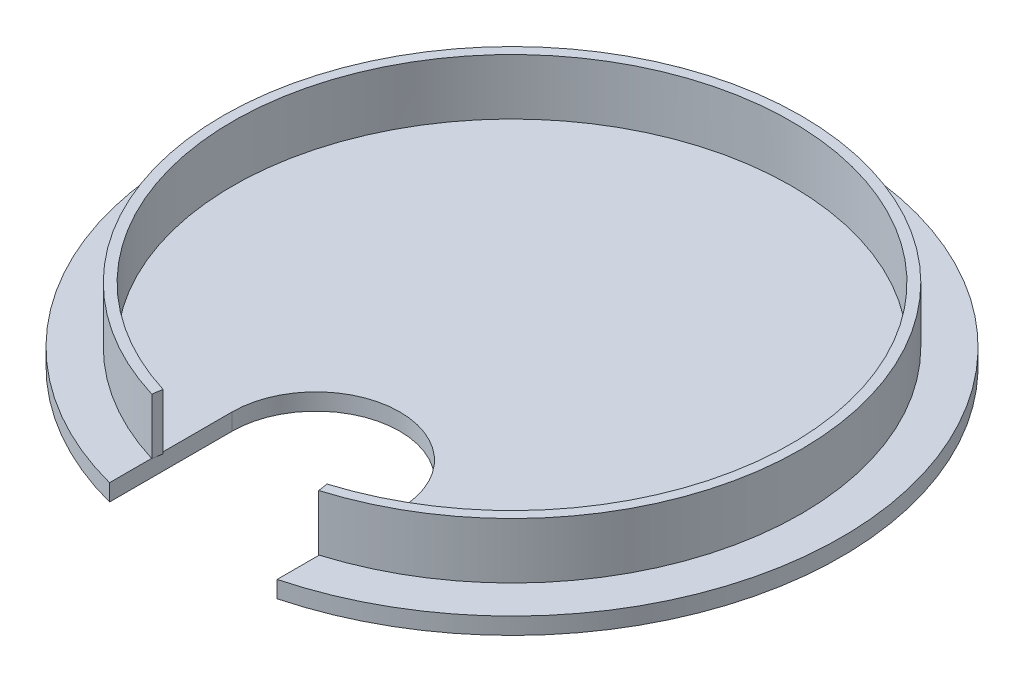
ISO-10303-21;
HEADER;
FILE_DESCRIPTION(('STEP AP214'),'2;1');
FILE_NAME('part.step','',(''),(''),'','','');
FILE_SCHEMA(('AUTOMOTIVE_DESIGN { 1 0 10303 214 1 1 1 1 }'));
ENDSEC;
DATA;
#1=APPLICATION_CONTEXT('core data for automotive mechanical design processes');
#2=APPLICATION_PROTOCOL_DEFINITION('international standard','automotive_design',2000,#1);
#3=PRODUCT_CONTEXT('',#1,'mechanical');
#4=PRODUCT('Part','Part','',(#3));
#5=PRODUCT_RELATED_PRODUCT_CATEGORY('part','',(#4));
#6=PRODUCT_DEFINITION_FORMATION('','',#4);
#7=PRODUCT_DEFINITION_CONTEXT('part definition',#1,'design');
#8=PRODUCT_DEFINITION('design','',#6,#7);
#9=PRODUCT_DEFINITION_SHAPE('','',#8);
#10=(LENGTH_UNIT() NAMED_UNIT(*) SI_UNIT(.MILLI.,.METRE.));
#11=(NAMED_UNIT(*) PLANE_ANGLE_UNIT() SI_UNIT($,.RADIAN.));
#12=(NAMED_UNIT(*) SI_UNIT($,.STERADIAN.) SOLID_ANGLE_UNIT());
#13=UNCERTAINTY_MEASURE_WITH_UNIT(LENGTH_MEASURE(1.E-05),#10,'distance_accuracy_value','');
#14=(GEOMETRIC_REPRESENTATION_CONTEXT(3) GLOBAL_UNCERTAINTY_ASSIGNED_CONTEXT((#13)) GLOBAL_UNIT_ASSIGNED_CONTEXT((#10,
#11,#12)) REPRESENTATION_CONTEXT('',''));
#15=CARTESIAN_POINT('',(0.,0.,0.));
#16=DIRECTION('',(0.,0.,1.));
#17=DIRECTION('',(1.,0.,0.));
#18=AXIS2_PLACEMENT_3D('',#15,#16,#17);
#19=CARTESIAN_POINT('',(0.,-12.2765699618567,17.5481321919634));
#20=DIRECTION('',(0.,1.,0.));
#21=DIRECTION('',(0.,0.,1.));
#22=AXIS2_PLACEMENT_3D('',#19,#20,#21);
#23=CYLINDRICAL_SURFACE('',#22,7.5);
#24=CARTESIAN_POINT('',(0.,2.72343003814335,17.5481321919634));
#25=DIRECTION('',(0.,1.,0.));
#26=DIRECTION('',(0.,0.,1.));
#27=AXIS2_PLACEMENT_3D('',#24,#25,#26);
#28=CIRCLE('',#27,7.5);
#29=CARTESIAN_POINT('',(7.5,2.72343003814335,17.5481321919634));
#30=VERTEX_POINT('',#29);
#31=CARTESIAN_POINT('',(-7.5,2.72343003814335,17.5481321919634));
#32=VERTEX_POINT('',#31);
#33=EDGE_CURVE('E131',#30,#32,#28,.T.);
#34=ORIENTED_EDGE('',*,*,#33,.T.);
#35=DIRECTION('',(0.,1.,0.));
#36=VECTOR('',#35,1.);
#37=CARTESIAN_POINT('',(-7.5,-12.2765699618567,17.5481321919634));
#38=LINE('',#37,#36);
#39=CARTESIAN_POINT('',(-7.5,1.22343003814335,17.5481321919634));
#40=VERTEX_POINT('',#39);
#41=EDGE_CURVE('E133',#40,#32,#38,.T.);
#42=ORIENTED_EDGE('',*,*,#41,.F.);
#43=CARTESIAN_POINT('',(0.,1.22343003814335,17.5481321919634));
#44=DIRECTION('',(0.,1.,0.));
#45=DIRECTION('',(0.,0.,1.));
#46=AXIS2_PLACEMENT_3D('',#43,#44,#45);
#47=CIRCLE('',#46,7.5);
#48=CARTESIAN_POINT('',(7.5,1.22343003814335,17.5481321919634));
#49=VERTEX_POINT('',#48);
#50=EDGE_CURVE('E39',#49,#40,#47,.T.);
#51=ORIENTED_EDGE('',*,*,#50,.F.);
#52=DIRECTION('',(0.,1.,0.));
#53=VECTOR('',#52,1.);
#54=CARTESIAN_POINT('',(7.5,-12.2765699618567,17.5481321919634));
#55=LINE('',#54,#53);
#56=EDGE_CURVE('E117',#49,#30,#55,.T.);
#57=ORIENTED_EDGE('',*,*,#56,.T.);
#58=EDGE_LOOP('',(#34,#42,#51,#57));
#59=FACE_BOUND('',#58,.T.);
#60=ADVANCED_FACE('F35',(#59),#23,.F.);
#61=CARTESIAN_POINT('',(0.,2.72343003814335,0.));
#62=DIRECTION('',(0.,-1.,0.));
#63=DIRECTION('',(0.,0.,-1.));
#64=AXIS2_PLACEMENT_3D('',#61,#62,#63);
#65=CYLINDRICAL_SURFACE('',#64,29.5);
#66=CARTESIAN_POINT('',(0.,1.22343003814335,0.));
#67=DIRECTION('',(0.,1.,0.));
#68=DIRECTION('',(0.,0.,1.));
#69=AXIS2_PLACEMENT_3D('',#66,#67,#68);
#70=CIRCLE('',#69,29.5);
#71=CARTESIAN_POINT('',(7.5,1.22343003814335,28.5306852353742));
#72=VERTEX_POINT('',#71);
#73=CARTESIAN_POINT('',(-7.5,1.22343003814335,28.5306852353742));
#74=VERTEX_POINT('',#73);
#75=EDGE_CURVE('E152',#72,#74,#70,.T.);
#76=ORIENTED_EDGE('',*,*,#75,.T.);
#77=DIRECTION('',(0.,-1.,0.));
#78=VECTOR('',#77,1.);
#79=CARTESIAN_POINT('',(-7.5,2.72343003814335,28.5306852353742));
#80=LINE('',#79,#78);
#81=CARTESIAN_POINT('',(-7.5,2.72343003814335,28.5306852353742));
#82=VERTEX_POINT('',#81);
#83=EDGE_CURVE('E163',#74,#82,#80,.F.);
#84=ORIENTED_EDGE('',*,*,#83,.T.);
#85=CARTESIAN_POINT('',(0.,2.72343003814335,0.));
#86=DIRECTION('',(0.,1.,0.));
#87=DIRECTION('',(0.,0.,1.));
#88=AXIS2_PLACEMENT_3D('',#85,#86,#87);
#89=CIRCLE('',#88,29.5);
#90=CARTESIAN_POINT('',(7.5,2.72343003814335,28.5306852353742));
#91=VERTEX_POINT('',#90);
#92=EDGE_CURVE('E154',#91,#82,#89,.T.);
#93=ORIENTED_EDGE('',*,*,#92,.F.);
#94=DIRECTION('',(0.,-1.,0.));
#95=VECTOR('',#94,1.);
#96=CARTESIAN_POINT('',(7.5,2.72343003814335,28.5306852353742));
#97=LINE('',#96,#95);
#98=EDGE_CURVE('E164',#91,#72,#97,.T.);
#99=ORIENTED_EDGE('',*,*,#98,.T.);
#100=EDGE_LOOP('',(#76,#84,#93,#99));
#101=FACE_BOUND('',#100,.T.);
#102=ADVANCED_FACE('F37',(#101),#65,.T.);
#103=CARTESIAN_POINT('',(0.,2.72343003814335,0.));
#104=DIRECTION('',(0.,1.,0.));
#105=DIRECTION('',(0.,0.,1.));
#106=AXIS2_PLACEMENT_3D('',#103,#104,#105);
#107=PLANE('',#106);
#108=DIRECTION('',(0.,0.,1.));
#109=VECTOR('',#108,1.);
#110=CARTESIAN_POINT('',(-7.5,2.72343003814335,17.5481321919634));
#111=LINE('',#110,#109);
#112=CARTESIAN_POINT('',(-7.5,2.72343003814335,24.7642004716486));
#113=VERTEX_POINT('',#112);
#114=EDGE_CURVE('E174',#113,#82,#111,.T.);
#115=ORIENTED_EDGE('',*,*,#114,.F.);
#116=CARTESIAN_POINT('',(0.,2.72343003814335,0.));
#117=DIRECTION('',(0.,1.,0.));
#118=DIRECTION('',(0.,0.,1.));
#119=AXIS2_PLACEMENT_3D('',#116,#117,#118);
#120=CIRCLE('',#119,25.875);
#121=CARTESIAN_POINT('',(7.5,2.72343003814335,24.7642004716486));
#122=VERTEX_POINT('',#121);
#123=EDGE_CURVE('E44',#122,#113,#120,.T.);
#124=ORIENTED_EDGE('',*,*,#123,.F.);
#125=DIRECTION('',(0.,0.,-1.));
#126=VECTOR('',#125,1.);
#127=CARTESIAN_POINT('',(7.5,2.72343003814335,17.5481321919634));
#128=LINE('',#127,#126);
#129=EDGE_CURVE('E127',#91,#122,#128,.T.);
#130=ORIENTED_EDGE('',*,*,#129,.F.);
#131=ORIENTED_EDGE('',*,*,#92,.T.);
#132=EDGE_LOOP('',(#115,#124,#130,#131));
#133=FACE_BOUND('',#132,.T.);
#134=ADVANCED_FACE('F214',(#133),#107,.T.);
#135=CARTESIAN_POINT('',(0.,1.22343003814335,0.));
#136=DIRECTION('',(0.,1.,0.));
#137=DIRECTION('',(0.,0.,1.));
#138=AXIS2_PLACEMENT_3D('',#135,#136,#137);
#139=PLANE('',#138);
#140=ORIENTED_EDGE('',*,*,#50,.T.);
#141=DIRECTION('',(0.,0.,1.));
#142=VECTOR('',#141,1.);
#143=CARTESIAN_POINT('',(-7.5,1.22343003814335,0.));
#144=LINE('',#143,#142);
#145=EDGE_CURVE('E168',#40,#74,#144,.T.);
#146=ORIENTED_EDGE('',*,*,#145,.T.);
#147=ORIENTED_EDGE('',*,*,#75,.F.);
#148=DIRECTION('',(0.,0.,-1.));
#149=VECTOR('',#148,1.);
#150=CARTESIAN_POINT('',(7.5,1.22343003814335,0.));
#151=LINE('',#150,#149);
#152=EDGE_CURVE('E167',#72,#49,#151,.T.);
#153=ORIENTED_EDGE('',*,*,#152,.T.);
#154=EDGE_LOOP('',(#140,#146,#147,#153));
#155=FACE_BOUND('',#154,.T.);
#156=ADVANCED_FACE('F166',(#155),#139,.F.);
#157=CARTESIAN_POINT('',(0.,7.72343003814335,0.));
#158=DIRECTION('',(0.,-1.,0.));
#159=DIRECTION('',(0.,0.,-1.));
#160=AXIS2_PLACEMENT_3D('',#157,#158,#159);
#161=CYLINDRICAL_SURFACE('',#160,25.875);
#162=CARTESIAN_POINT('',(7.46354093062821,2.72343003814335,24.7752130520978));
#163=VERTEX_POINT('',#162);
#164=EDGE_CURVE('E11',#163,#122,#120,.T.);
#165=ORIENTED_EDGE('',*,*,#164,.T.);
#166=ORIENTED_EDGE('',*,*,#123,.T.);
#167=CARTESIAN_POINT('',(0.,2.72343003814335,0.));
#168=DIRECTION('',(0.,1.,0.));
#169=DIRECTION('',(0.,0.,1.));
#170=AXIS2_PLACEMENT_3D('',#167,#168,#169);
#171=CIRCLE('',#170,25.875);
#172=CARTESIAN_POINT('',(-7.46354093062822,2.72343003814335,24.7752130520978));
#173=VERTEX_POINT('',#172);
#174=EDGE_CURVE('E175',#113,#173,#171,.T.);
#175=ORIENTED_EDGE('',*,*,#174,.T.);
#176=DIRECTION('',(0.,1.,0.));
#177=VECTOR('',#176,1.);
#178=CARTESIAN_POINT('',(-7.46354093062822,0.223430038143348,24.7752130520978));
#179=LINE('',#178,#177);
#180=CARTESIAN_POINT('',(-7.46354093062822,7.72343003814335,24.7752130520978));
#181=VERTEX_POINT('',#180);
#182=EDGE_CURVE('E188',#173,#181,#179,.T.);
#183=ORIENTED_EDGE('',*,*,#182,.T.);
#184=CARTESIAN_POINT('',(0.,7.72343003814335,0.));
#185=DIRECTION('',(0.,1.,0.));
#186=DIRECTION('',(0.,0.,1.));
#187=AXIS2_PLACEMENT_3D('',#184,#185,#186);
#188=CIRCLE('',#187,25.875);
#189=CARTESIAN_POINT('',(7.46354093062822,7.72343003814335,24.7752130520978));
#190=VERTEX_POINT('',#189);
#191=EDGE_CURVE('E147',#190,#181,#188,.T.);
#192=ORIENTED_EDGE('',*,*,#191,.F.);
#193=DIRECTION('',(0.,1.,0.));
#194=VECTOR('',#193,1.);
#195=CARTESIAN_POINT('',(7.46354093062822,0.223430038143348,24.7752130520978));
#196=LINE('',#195,#194);
#197=EDGE_CURVE('E137',#190,#163,#196,.F.);
#198=ORIENTED_EDGE('',*,*,#197,.T.);
#199=EDGE_LOOP('',(#165,#166,#175,#183,#192,#198));
#200=FACE_BOUND('',#199,.T.);
#201=ADVANCED_FACE('F206',(#200),#161,.T.);
#202=CARTESIAN_POINT('',(0.,7.72343003814335,0.));
#203=DIRECTION('',(0.,1.,0.));
#204=DIRECTION('',(0.,0.,1.));
#205=AXIS2_PLACEMENT_3D('',#202,#203,#204);
#206=PLANE('',#205);
#207=CARTESIAN_POINT('',(0.,7.72343003814335,25.5138312057045));
#208=DIRECTION('',(0.,1.,0.));
#209=DIRECTION('',(0.,0.,1.));
#210=AXIS2_PLACEMENT_3D('',#207,#208,#209);
#211=CIRCLE('',#210,7.5);
#212=CARTESIAN_POINT('',(7.3249353459603,7.72343003814335,23.9028308402478));
#213=VERTEX_POINT('',#212);
#214=EDGE_CURVE('E183',#190,#213,#211,.T.);
#215=ORIENTED_EDGE('',*,*,#214,.F.);
#216=ORIENTED_EDGE('',*,*,#191,.T.);
#217=CARTESIAN_POINT('',(-7.3249353459603,7.72343003814335,23.9028308402478));
#218=VERTEX_POINT('',#217);
#219=EDGE_CURVE('E182',#218,#181,#211,.T.);
#220=ORIENTED_EDGE('',*,*,#219,.F.);
#221=CARTESIAN_POINT('',(0.,7.72343003814335,0.));
#222=DIRECTION('',(0.,1.,0.));
#223=DIRECTION('',(0.,0.,1.));
#224=AXIS2_PLACEMENT_3D('',#221,#222,#223);
#225=CIRCLE('',#224,25.);
#226=EDGE_CURVE('E139',#213,#218,#225,.T.);
#227=ORIENTED_EDGE('',*,*,#226,.F.);
#228=EDGE_LOOP('',(#215,#216,#220,#227));
#229=FACE_BOUND('',#228,.T.);
#230=ADVANCED_FACE('F200',(#229),#206,.T.);
#231=CARTESIAN_POINT('',(0.,2.72343003814335,0.));
#232=DIRECTION('',(0.,1.,0.));
#233=DIRECTION('',(0.,0.,1.));
#234=AXIS2_PLACEMENT_3D('',#231,#232,#233);
#235=CYLINDRICAL_SURFACE('',#234,25.);
#236=CARTESIAN_POINT('',(0.,2.72343003814335,0.));
#237=DIRECTION('',(0.,1.,0.));
#238=DIRECTION('',(0.,0.,1.));
#239=AXIS2_PLACEMENT_3D('',#236,#237,#238);
#240=CIRCLE('',#239,25.);
#241=CARTESIAN_POINT('',(7.3249353459603,2.72343003814335,23.9028308402478));
#242=VERTEX_POINT('',#241);
#243=CARTESIAN_POINT('',(7.5,2.72343003814335,23.8484800354236));
#244=VERTEX_POINT('',#243);
#245=EDGE_CURVE('E145',#242,#244,#240,.T.);
#246=ORIENTED_EDGE('',*,*,#245,.F.);
#247=DIRECTION('',(0.,1.,0.));
#248=VECTOR('',#247,1.);
#249=CARTESIAN_POINT('',(7.3249353459603,0.223430038143348,23.9028308402478));
#250=LINE('',#249,#248);
#251=EDGE_CURVE('E141',#242,#213,#250,.T.);
#252=ORIENTED_EDGE('',*,*,#251,.T.);
#253=ORIENTED_EDGE('',*,*,#226,.T.);
#254=DIRECTION('',(0.,1.,0.));
#255=VECTOR('',#254,1.);
#256=CARTESIAN_POINT('',(-7.3249353459603,0.223430038143348,23.9028308402478));
#257=LINE('',#256,#255);
#258=CARTESIAN_POINT('',(-7.32493534596031,2.72343003814335,23.9028308402478));
#259=VERTEX_POINT('',#258);
#260=EDGE_CURVE('E185',#218,#259,#257,.F.);
#261=ORIENTED_EDGE('',*,*,#260,.T.);
#262=CARTESIAN_POINT('',(0.,2.72343003814335,0.));
#263=DIRECTION('',(0.,1.,0.));
#264=DIRECTION('',(0.,0.,1.));
#265=AXIS2_PLACEMENT_3D('',#262,#263,#264);
#266=CIRCLE('',#265,25.);
#267=CARTESIAN_POINT('',(-7.5,2.72343003814335,23.8484800354236));
#268=VERTEX_POINT('',#267);
#269=EDGE_CURVE('E58',#259,#268,#266,.F.);
#270=ORIENTED_EDGE('',*,*,#269,.T.);
#271=EDGE_CURVE('E148',#244,#268,#240,.T.);
#272=ORIENTED_EDGE('',*,*,#271,.F.);
#273=EDGE_LOOP('',(#246,#252,#253,#261,#270,#272));
#274=FACE_BOUND('',#273,.T.);
#275=ADVANCED_FACE('F195',(#274),#235,.F.);
#276=CARTESIAN_POINT('',(0.,2.72343003814335,0.));
#277=DIRECTION('',(0.,1.,0.));
#278=DIRECTION('',(0.,0.,1.));
#279=AXIS2_PLACEMENT_3D('',#276,#277,#278);
#280=PLANE('',#279);
#281=EDGE_CURVE('E125',#32,#268,#111,.T.);
#282=ORIENTED_EDGE('',*,*,#281,.F.);
#283=ORIENTED_EDGE('',*,*,#33,.F.);
#284=EDGE_CURVE('E114',#244,#30,#128,.T.);
#285=ORIENTED_EDGE('',*,*,#284,.F.);
#286=ORIENTED_EDGE('',*,*,#271,.T.);
#287=EDGE_LOOP('',(#282,#283,#285,#286));
#288=FACE_BOUND('',#287,.T.);
#289=ADVANCED_FACE('F136',(#288),#280,.T.);
#290=CARTESIAN_POINT('',(0.,-7.27656996185665,25.5138312057045));
#291=DIRECTION('',(0.,1.,0.));
#292=DIRECTION('',(0.,0.,1.));
#293=AXIS2_PLACEMENT_3D('',#290,#291,#292);
#294=CYLINDRICAL_SURFACE('',#293,7.5);
#295=ORIENTED_EDGE('',*,*,#182,.F.);
#296=CARTESIAN_POINT('',(0.,2.72343003814335,25.5138312057045));
#297=DIRECTION('',(0.,1.,0.));
#298=DIRECTION('',(0.,0.,1.));
#299=AXIS2_PLACEMENT_3D('',#296,#297,#298);
#300=CIRCLE('',#299,7.5);
#301=EDGE_CURVE('E211',#173,#259,#300,.F.);
#302=ORIENTED_EDGE('',*,*,#301,.T.);
#303=ORIENTED_EDGE('',*,*,#260,.F.);
#304=ORIENTED_EDGE('',*,*,#219,.T.);
#305=EDGE_LOOP('',(#295,#302,#303,#304));
#306=FACE_BOUND('',#305,.T.);
#307=ADVANCED_FACE('F204',(#306),#294,.F.);
#308=ORIENTED_EDGE('',*,*,#251,.F.);
#309=CARTESIAN_POINT('',(0.,2.72343003814335,25.5138312057045));
#310=DIRECTION('',(0.,1.,0.));
#311=DIRECTION('',(0.,0.,1.));
#312=AXIS2_PLACEMENT_3D('',#309,#310,#311);
#313=CIRCLE('',#312,7.5);
#314=EDGE_CURVE('E219',#242,#163,#313,.F.);
#315=ORIENTED_EDGE('',*,*,#314,.T.);
#316=ORIENTED_EDGE('',*,*,#197,.F.);
#317=ORIENTED_EDGE('',*,*,#214,.T.);
#318=EDGE_LOOP('',(#308,#315,#316,#317));
#319=FACE_BOUND('',#318,.T.);
#320=ADVANCED_FACE('F221',(#319),#294,.F.);
#321=CARTESIAN_POINT('',(0.,2.72343003814335,0.));
#322=DIRECTION('',(0.,1.,0.));
#323=DIRECTION('',(0.,0.,1.));
#324=AXIS2_PLACEMENT_3D('',#321,#322,#323);
#325=PLANE('',#324);
#326=ORIENTED_EDGE('',*,*,#314,.F.);
#327=ORIENTED_EDGE('',*,*,#245,.T.);
#328=EDGE_CURVE('E119',#122,#244,#128,.T.);
#329=ORIENTED_EDGE('',*,*,#328,.F.);
#330=ORIENTED_EDGE('',*,*,#164,.F.);
#331=EDGE_LOOP('',(#326,#327,#329,#330));
#332=FACE_BOUND('',#331,.T.);
#333=ADVANCED_FACE('F222',(#332),#325,.F.);
#334=CARTESIAN_POINT('',(7.5,-12.2765699618567,17.5481321919634));
#335=DIRECTION('',(1.,0.,0.));
#336=DIRECTION('',(0.,0.,-1.));
#337=AXIS2_PLACEMENT_3D('',#334,#335,#336);
#338=PLANE('',#337);
#339=ORIENTED_EDGE('',*,*,#129,.T.);
#340=ORIENTED_EDGE('',*,*,#328,.T.);
#341=ORIENTED_EDGE('',*,*,#284,.T.);
#342=ORIENTED_EDGE('',*,*,#56,.F.);
#343=ORIENTED_EDGE('',*,*,#152,.F.);
#344=ORIENTED_EDGE('',*,*,#98,.F.);
#345=EDGE_LOOP('',(#339,#340,#341,#342,#343,#344));
#346=FACE_BOUND('',#345,.T.);
#347=ADVANCED_FACE('F116',(#346),#338,.F.);
#348=CARTESIAN_POINT('',(-7.5,-12.2765699618567,17.5481321919634));
#349=DIRECTION('',(-1.,0.,0.));
#350=DIRECTION('',(0.,0.,1.));
#351=AXIS2_PLACEMENT_3D('',#348,#349,#350);
#352=PLANE('',#351);
#353=ORIENTED_EDGE('',*,*,#41,.T.);
#354=ORIENTED_EDGE('',*,*,#281,.T.);
#355=EDGE_CURVE('E210',#268,#113,#111,.T.);
#356=ORIENTED_EDGE('',*,*,#355,.T.);
#357=ORIENTED_EDGE('',*,*,#114,.T.);
#358=ORIENTED_EDGE('',*,*,#83,.F.);
#359=ORIENTED_EDGE('',*,*,#145,.F.);
#360=EDGE_LOOP('',(#353,#354,#356,#357,#358,#359));
#361=FACE_BOUND('',#360,.T.);
#362=ADVANCED_FACE('F171',(#361),#352,.F.);
#363=ORIENTED_EDGE('',*,*,#355,.F.);
#364=ORIENTED_EDGE('',*,*,#269,.F.);
#365=ORIENTED_EDGE('',*,*,#301,.F.);
#366=ORIENTED_EDGE('',*,*,#174,.F.);
#367=EDGE_LOOP('',(#363,#364,#365,#366));
#368=FACE_BOUND('',#367,.T.);
#369=ADVANCED_FACE('F209',(#368),#325,.F.);
#370=CLOSED_SHELL('',(#60,#102,#134,#156,#201,#230,#275,#289,#307,#320,#333,#347,#362,#369));
#371=MANIFOLD_SOLID_BREP('B2',#370);
#372=ADVANCED_BREP_SHAPE_REPRESENTATION('',(#18,#371),#14);
#373=SHAPE_DEFINITION_REPRESENTATION(#9,#372);
ENDSEC;
END-ISO-10303-21;
